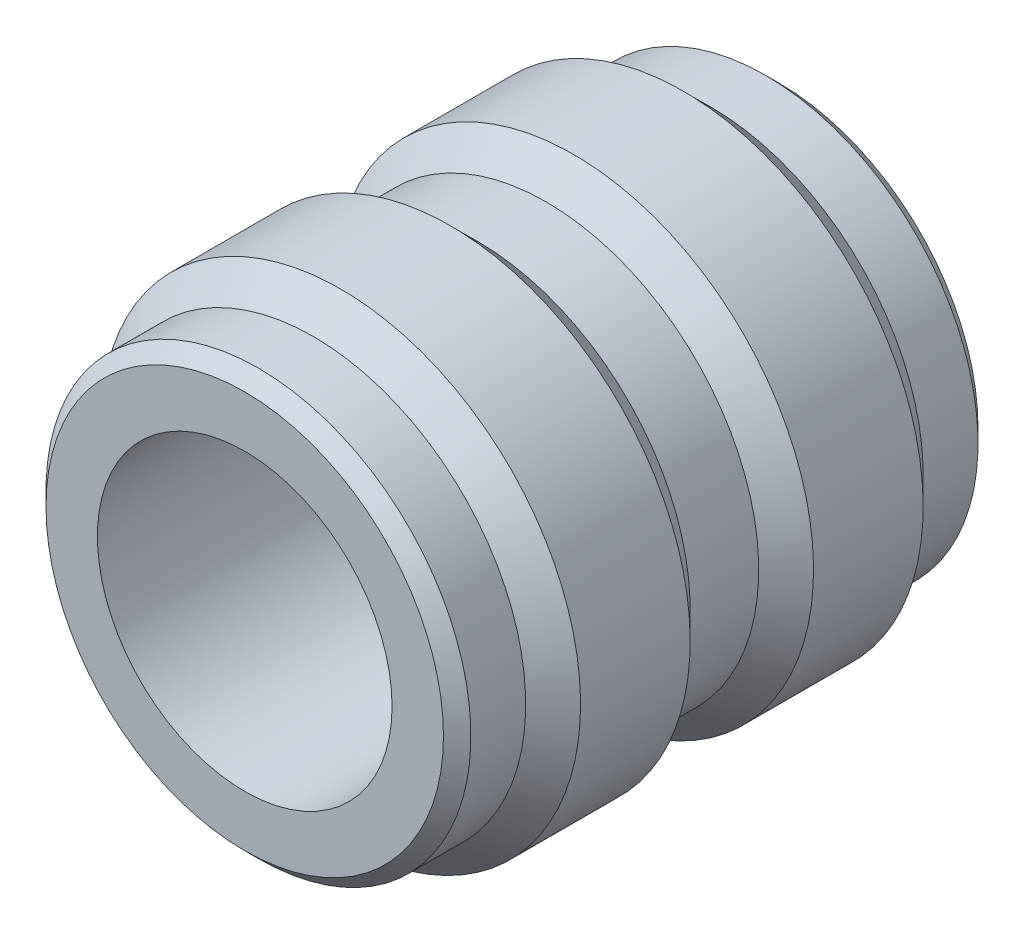
ISO-10303-21;
HEADER;
FILE_DESCRIPTION(('STEP AP214'),'2;1');
FILE_NAME('part.step','',(''),(''),'','','');
FILE_SCHEMA(('AUTOMOTIVE_DESIGN { 1 0 10303 214 1 1 1 1 }'));
ENDSEC;
DATA;
#1=APPLICATION_CONTEXT('core data for automotive mechanical design processes');
#2=APPLICATION_PROTOCOL_DEFINITION('international standard','automotive_design',2000,#1);
#3=PRODUCT_CONTEXT('',#1,'mechanical');
#4=PRODUCT('Part','Part','',(#3));
#5=PRODUCT_RELATED_PRODUCT_CATEGORY('part','',(#4));
#6=PRODUCT_DEFINITION_FORMATION('','',#4);
#7=PRODUCT_DEFINITION_CONTEXT('part definition',#1,'design');
#8=PRODUCT_DEFINITION('design','',#6,#7);
#9=PRODUCT_DEFINITION_SHAPE('','',#8);
#10=(LENGTH_UNIT() NAMED_UNIT(*) SI_UNIT(.MILLI.,.METRE.));
#11=(NAMED_UNIT(*) PLANE_ANGLE_UNIT() SI_UNIT($,.RADIAN.));
#12=(NAMED_UNIT(*) SI_UNIT($,.STERADIAN.) SOLID_ANGLE_UNIT());
#13=UNCERTAINTY_MEASURE_WITH_UNIT(LENGTH_MEASURE(1.E-05),#10,'distance_accuracy_value','');
#14=(GEOMETRIC_REPRESENTATION_CONTEXT(3) GLOBAL_UNCERTAINTY_ASSIGNED_CONTEXT((#13)) GLOBAL_UNIT_ASSIGNED_CONTEXT((#10,
#11,#12)) REPRESENTATION_CONTEXT('',''));
#15=CARTESIAN_POINT('',(0.,0.,0.));
#16=DIRECTION('',(0.,0.,1.));
#17=DIRECTION('',(1.,0.,0.));
#18=AXIS2_PLACEMENT_3D('',#15,#16,#17);
#19=CARTESIAN_POINT('',(0.,0.,-1.825));
#20=DIRECTION('',(0.,0.,-1.));
#21=DIRECTION('',(0.,1.,0.));
#22=AXIS2_PLACEMENT_3D('',#19,#20,#21);
#23=CYLINDRICAL_SURFACE('',#22,1.55);
#24=CARTESIAN_POINT('',(0.,0.,-2.2));
#25=DIRECTION('',(0.,0.,-1.));
#26=DIRECTION('',(1.,0.,0.));
#27=AXIS2_PLACEMENT_3D('',#24,#25,#26);
#28=CIRCLE('',#27,1.55);
#29=CARTESIAN_POINT('',(0.,-1.55,-2.2));
#30=VERTEX_POINT('',#29);
#31=EDGE_CURVE('E183',#30,#30,#28,.T.);
#32=ORIENTED_EDGE('',*,*,#31,.F.);
#33=DIRECTION('',(0.,0.,1.));
#34=VECTOR('',#33,1.);
#35=CARTESIAN_POINT('',(0.,-1.55,-1.825));
#36=LINE('',#35,#34);
#37=CARTESIAN_POINT('',(0.,-1.55,-1.7));
#38=VERTEX_POINT('',#37);
#39=EDGE_CURVE('E11',#30,#38,#36,.T.);
#40=ORIENTED_EDGE('',*,*,#39,.T.);
#41=CARTESIAN_POINT('',(0.,0.,-1.7));
#42=DIRECTION('',(0.,0.,-1.));
#43=DIRECTION('',(1.,0.,0.));
#44=AXIS2_PLACEMENT_3D('',#41,#42,#43);
#45=CIRCLE('',#44,1.55);
#46=EDGE_CURVE('E212',#38,#38,#45,.T.);
#47=ORIENTED_EDGE('',*,*,#46,.T.);
#48=ORIENTED_EDGE('',*,*,#39,.F.);
#49=EDGE_LOOP('',(#32,#40,#47,#48));
#50=FACE_BOUND('',#49,.T.);
#51=ADVANCED_FACE('F54',(#50),#23,.T.);
#52=CARTESIAN_POINT('',(0.,0.,-1.6));
#53=DIRECTION('',(0.,0.,1.));
#54=DIRECTION('',(0.,1.,0.));
#55=AXIS2_PLACEMENT_3D('',#52,#53,#54);
#56=CONICAL_SURFACE('',#55,1.65,0.785398163397448);
#57=ORIENTED_EDGE('',*,*,#46,.F.);
#58=DIRECTION('',(0.,-0.707106781186548,0.707106781186547));
#59=VECTOR('',#58,1.);
#60=CARTESIAN_POINT('',(0.,-1.65,-1.6));
#61=LINE('',#60,#59);
#62=CARTESIAN_POINT('',(0.,-1.75,-1.5));
#63=VERTEX_POINT('',#62);
#64=EDGE_CURVE('E62',#38,#63,#61,.T.);
#65=ORIENTED_EDGE('',*,*,#64,.T.);
#66=CARTESIAN_POINT('',(0.,0.,-1.5));
#67=DIRECTION('',(0.,0.,-1.));
#68=DIRECTION('',(1.,0.,0.));
#69=AXIS2_PLACEMENT_3D('',#66,#67,#68);
#70=CIRCLE('',#69,1.75);
#71=EDGE_CURVE('E210',#63,#63,#70,.T.);
#72=ORIENTED_EDGE('',*,*,#71,.T.);
#73=ORIENTED_EDGE('',*,*,#64,.F.);
#74=EDGE_LOOP('',(#57,#65,#72,#73));
#75=FACE_BOUND('',#74,.T.);
#76=ADVANCED_FACE('F219',(#75),#56,.T.);
#77=CARTESIAN_POINT('',(0.,0.,-1.1));
#78=DIRECTION('',(0.,0.,-1.));
#79=DIRECTION('',(0.,1.,0.));
#80=AXIS2_PLACEMENT_3D('',#77,#78,#79);
#81=CYLINDRICAL_SURFACE('',#80,1.75);
#82=ORIENTED_EDGE('',*,*,#71,.F.);
#83=DIRECTION('',(0.,0.,1.));
#84=VECTOR('',#83,1.);
#85=CARTESIAN_POINT('',(0.,-1.75,-1.1));
#86=LINE('',#85,#84);
#87=CARTESIAN_POINT('',(0.,-1.75,-0.7));
#88=VERTEX_POINT('',#87);
#89=EDGE_CURVE('E213',#63,#88,#86,.T.);
#90=ORIENTED_EDGE('',*,*,#89,.T.);
#91=CARTESIAN_POINT('',(0.,0.,-0.7));
#92=DIRECTION('',(0.,0.,-1.));
#93=DIRECTION('',(1.,0.,0.));
#94=AXIS2_PLACEMENT_3D('',#91,#92,#93);
#95=CIRCLE('',#94,1.75);
#96=EDGE_CURVE('E202',#88,#88,#95,.T.);
#97=ORIENTED_EDGE('',*,*,#96,.T.);
#98=ORIENTED_EDGE('',*,*,#89,.F.);
#99=EDGE_LOOP('',(#82,#90,#97,#98));
#100=FACE_BOUND('',#99,.T.);
#101=ADVANCED_FACE('F223',(#100),#81,.T.);
#102=CARTESIAN_POINT('',(0.,0.,-0.6));
#103=DIRECTION('',(0.,0.,-1.));
#104=DIRECTION('',(0.,1.,0.));
#105=AXIS2_PLACEMENT_3D('',#102,#103,#104);
#106=CONICAL_SURFACE('',#105,1.65,0.785398163397447);
#107=ORIENTED_EDGE('',*,*,#96,.F.);
#108=DIRECTION('',(0.,0.707106781186547,0.707106781186548));
#109=VECTOR('',#108,1.);
#110=CARTESIAN_POINT('',(0.,-1.65,-0.6));
#111=LINE('',#110,#109);
#112=CARTESIAN_POINT('',(0.,-1.55,-0.5));
#113=VERTEX_POINT('',#112);
#114=EDGE_CURVE('E129',#88,#113,#111,.T.);
#115=ORIENTED_EDGE('',*,*,#114,.T.);
#116=CARTESIAN_POINT('',(0.,0.,-0.5));
#117=DIRECTION('',(0.,0.,-1.));
#118=DIRECTION('',(1.,0.,0.));
#119=AXIS2_PLACEMENT_3D('',#116,#117,#118);
#120=CIRCLE('',#119,1.55);
#121=EDGE_CURVE('E174',#113,#113,#120,.T.);
#122=ORIENTED_EDGE('',*,*,#121,.T.);
#123=ORIENTED_EDGE('',*,*,#114,.F.);
#124=EDGE_LOOP('',(#107,#115,#122,#123));
#125=FACE_BOUND('',#124,.T.);
#126=ADVANCED_FACE('F352',(#125),#106,.T.);
#127=CARTESIAN_POINT('',(0.,0.,-2.3));
#128=DIRECTION('',(0.,0.,-1.));
#129=DIRECTION('',(0.,1.,0.));
#130=AXIS2_PLACEMENT_3D('',#127,#128,#129);
#131=CONICAL_SURFACE('',#130,1.65,0.785398163397448);
#132=ORIENTED_EDGE('',*,*,#31,.T.);
#133=DIRECTION('',(0.,-0.707106781186548,-0.707106781186547));
#134=VECTOR('',#133,1.);
#135=CARTESIAN_POINT('',(0.,-1.65,-2.3));
#136=LINE('',#135,#134);
#137=CARTESIAN_POINT('',(0.,-1.75,-2.4));
#138=VERTEX_POINT('',#137);
#139=EDGE_CURVE('E190',#30,#138,#136,.T.);
#140=ORIENTED_EDGE('',*,*,#139,.T.);
#141=CARTESIAN_POINT('',(0.,0.,-2.4));
#142=DIRECTION('',(0.,0.,-1.));
#143=DIRECTION('',(1.,0.,0.));
#144=AXIS2_PLACEMENT_3D('',#141,#142,#143);
#145=CIRCLE('',#144,1.75);
#146=EDGE_CURVE('E199',#138,#138,#145,.T.);
#147=ORIENTED_EDGE('',*,*,#146,.F.);
#148=ORIENTED_EDGE('',*,*,#139,.F.);
#149=EDGE_LOOP('',(#132,#140,#147,#148));
#150=FACE_BOUND('',#149,.T.);
#151=ADVANCED_FACE('F250',(#150),#131,.T.);
#152=CARTESIAN_POINT('',(0.,0.,-2.8));
#153=DIRECTION('',(0.,0.,-1.));
#154=DIRECTION('',(0.,1.,0.));
#155=AXIS2_PLACEMENT_3D('',#152,#153,#154);
#156=CYLINDRICAL_SURFACE('',#155,1.75);
#157=ORIENTED_EDGE('',*,*,#146,.T.);
#158=DIRECTION('',(0.,0.,-1.));
#159=VECTOR('',#158,1.);
#160=CARTESIAN_POINT('',(0.,-1.75,-2.8));
#161=LINE('',#160,#159);
#162=CARTESIAN_POINT('',(0.,-1.75,-3.2));
#163=VERTEX_POINT('',#162);
#164=EDGE_CURVE('E187',#138,#163,#161,.T.);
#165=ORIENTED_EDGE('',*,*,#164,.T.);
#166=CARTESIAN_POINT('',(0.,0.,-3.2));
#167=DIRECTION('',(0.,0.,-1.));
#168=DIRECTION('',(1.,0.,0.));
#169=AXIS2_PLACEMENT_3D('',#166,#167,#168);
#170=CIRCLE('',#169,1.75);
#171=EDGE_CURVE('E194',#163,#163,#170,.T.);
#172=ORIENTED_EDGE('',*,*,#171,.F.);
#173=ORIENTED_EDGE('',*,*,#164,.F.);
#174=EDGE_LOOP('',(#157,#165,#172,#173));
#175=FACE_BOUND('',#174,.T.);
#176=ADVANCED_FACE('F243',(#175),#156,.T.);
#177=CARTESIAN_POINT('',(0.,0.,-3.3));
#178=DIRECTION('',(0.,0.,1.));
#179=DIRECTION('',(0.,1.,0.));
#180=AXIS2_PLACEMENT_3D('',#177,#178,#179);
#181=CONICAL_SURFACE('',#180,1.65,0.785398163397447);
#182=ORIENTED_EDGE('',*,*,#171,.T.);
#183=DIRECTION('',(0.,0.707106781186547,-0.707106781186548));
#184=VECTOR('',#183,1.);
#185=CARTESIAN_POINT('',(0.,-1.65,-3.3));
#186=LINE('',#185,#184);
#187=CARTESIAN_POINT('',(0.,-1.55,-3.4));
#188=VERTEX_POINT('',#187);
#189=EDGE_CURVE('E200',#163,#188,#186,.T.);
#190=ORIENTED_EDGE('',*,*,#189,.T.);
#191=CARTESIAN_POINT('',(0.,0.,-3.4));
#192=DIRECTION('',(0.,0.,-1.));
#193=DIRECTION('',(1.,0.,0.));
#194=AXIS2_PLACEMENT_3D('',#191,#192,#193);
#195=CIRCLE('',#194,1.55);
#196=EDGE_CURVE('E185',#188,#188,#195,.T.);
#197=ORIENTED_EDGE('',*,*,#196,.F.);
#198=ORIENTED_EDGE('',*,*,#189,.F.);
#199=EDGE_LOOP('',(#182,#190,#197,#198));
#200=FACE_BOUND('',#199,.T.);
#201=ADVANCED_FACE('F298',(#200),#181,.T.);
#202=CARTESIAN_POINT('',(0.,0.,-3.65));
#203=DIRECTION('',(0.,0.,-1.));
#204=DIRECTION('',(0.,1.,0.));
#205=AXIS2_PLACEMENT_3D('',#202,#203,#204);
#206=CYLINDRICAL_SURFACE('',#205,1.55);
#207=ORIENTED_EDGE('',*,*,#196,.T.);
#208=DIRECTION('',(0.,0.,-1.));
#209=VECTOR('',#208,1.);
#210=CARTESIAN_POINT('',(0.,-1.55,-3.65));
#211=LINE('',#210,#209);
#212=CARTESIAN_POINT('',(0.,-1.55,-3.8));
#213=VERTEX_POINT('',#212);
#214=EDGE_CURVE('E95',#188,#213,#211,.T.);
#215=ORIENTED_EDGE('',*,*,#214,.T.);
#216=CARTESIAN_POINT('',(0.,0.,-3.8));
#217=DIRECTION('',(0.,0.,-1.));
#218=DIRECTION('',(0.,-1.,0.));
#219=AXIS2_PLACEMENT_3D('',#216,#217,#218);
#220=CIRCLE('',#219,1.55);
#221=CARTESIAN_POINT('',(0.,1.55,-3.8));
#222=VERTEX_POINT('',#221);
#223=EDGE_CURVE('E169',#222,#213,#220,.T.);
#224=ORIENTED_EDGE('',*,*,#223,.F.);
#225=CARTESIAN_POINT('',(0.,0.,-3.8));
#226=DIRECTION('',(0.,0.,-1.));
#227=DIRECTION('',(0.,-1.,0.));
#228=AXIS2_PLACEMENT_3D('',#225,#226,#227);
#229=CIRCLE('',#228,1.55);
#230=EDGE_CURVE('E110',#213,#222,#229,.T.);
#231=ORIENTED_EDGE('',*,*,#230,.F.);
#232=ORIENTED_EDGE('',*,*,#214,.F.);
#233=EDGE_LOOP('',(#207,#215,#224,#231,#232));
#234=FACE_BOUND('',#233,.T.);
#235=ADVANCED_FACE('F332',(#234),#206,.T.);
#236=CARTESIAN_POINT('',(0.,1.55,-3.9));
#237=DIRECTION('',(0.,0.,1.));
#238=DIRECTION('',(1.,0.,0.));
#239=AXIS2_PLACEMENT_3D('',#236,#237,#238);
#240=PLANE('',#239);
#241=CARTESIAN_POINT('',(0.,0.,-3.9));
#242=DIRECTION('',(0.,0.,-1.));
#243=DIRECTION('',(-1.,0.,0.));
#244=AXIS2_PLACEMENT_3D('',#241,#242,#243);
#245=CIRCLE('',#244,1.075);
#246=CARTESIAN_POINT('',(-1.075,0.,-3.9));
#247=VERTEX_POINT('',#246);
#248=EDGE_CURVE('E163',#247,#247,#245,.F.);
#249=ORIENTED_EDGE('',*,*,#248,.T.);
#250=EDGE_LOOP('',(#249));
#251=FACE_BOUND('',#250,.T.);
#252=CARTESIAN_POINT('',(0.,0.,-3.9));
#253=DIRECTION('',(0.,0.,1.));
#254=DIRECTION('',(0.,-1.,0.));
#255=AXIS2_PLACEMENT_3D('',#252,#253,#254);
#256=CIRCLE('',#255,1.45);
#257=CARTESIAN_POINT('',(0.,1.45,-3.9));
#258=VERTEX_POINT('',#257);
#259=EDGE_CURVE('E172',#258,#258,#256,.T.);
#260=ORIENTED_EDGE('',*,*,#259,.F.);
#261=EDGE_LOOP('',(#260));
#262=FACE_BOUND('',#261,.T.);
#263=ADVANCED_FACE('F327',(#251,#262),#240,.F.);
#264=CARTESIAN_POINT('',(0.,0.,-3.85));
#265=DIRECTION('',(0.,0.,1.));
#266=DIRECTION('',(0.,-1.,0.));
#267=AXIS2_PLACEMENT_3D('',#264,#265,#266);
#268=CONICAL_SURFACE('',#267,1.5,0.785398163397448);
#269=ORIENTED_EDGE('',*,*,#259,.T.);
#270=DIRECTION('',(0.,0.707106781186548,0.707106781186548));
#271=VECTOR('',#270,1.);
#272=CARTESIAN_POINT('',(0.,1.5,-3.85));
#273=LINE('',#272,#271);
#274=EDGE_CURVE('E177',#258,#222,#273,.T.);
#275=ORIENTED_EDGE('',*,*,#274,.T.);
#276=ORIENTED_EDGE('',*,*,#223,.T.);
#277=ORIENTED_EDGE('',*,*,#230,.T.);
#278=ORIENTED_EDGE('',*,*,#274,.F.);
#279=EDGE_LOOP('',(#269,#275,#276,#277,#278));
#280=FACE_BOUND('',#279,.T.);
#281=ADVANCED_FACE('F317',(#280),#268,.T.);
#282=CARTESIAN_POINT('',(0.,0.,-0.25));
#283=DIRECTION('',(0.,0.,-1.));
#284=DIRECTION('',(0.,1.,0.));
#285=AXIS2_PLACEMENT_3D('',#282,#283,#284);
#286=CYLINDRICAL_SURFACE('',#285,1.55);
#287=ORIENTED_EDGE('',*,*,#121,.F.);
#288=DIRECTION('',(0.,0.,1.));
#289=VECTOR('',#288,1.);
#290=CARTESIAN_POINT('',(0.,-1.55,-0.25));
#291=LINE('',#290,#289);
#292=CARTESIAN_POINT('',(0.,-1.55,-0.1));
#293=VERTEX_POINT('',#292);
#294=EDGE_CURVE('E159',#113,#293,#291,.T.);
#295=ORIENTED_EDGE('',*,*,#294,.T.);
#296=CARTESIAN_POINT('',(0.,0.,-0.1));
#297=DIRECTION('',(0.,0.,1.));
#298=DIRECTION('',(0.,-1.,0.));
#299=AXIS2_PLACEMENT_3D('',#296,#297,#298);
#300=CIRCLE('',#299,1.55);
#301=CARTESIAN_POINT('',(0.,1.55,-0.1));
#302=VERTEX_POINT('',#301);
#303=EDGE_CURVE('E146',#302,#293,#300,.T.);
#304=ORIENTED_EDGE('',*,*,#303,.F.);
#305=CARTESIAN_POINT('',(0.,0.,-0.1));
#306=DIRECTION('',(0.,0.,1.));
#307=DIRECTION('',(0.,-1.,0.));
#308=AXIS2_PLACEMENT_3D('',#305,#306,#307);
#309=CIRCLE('',#308,1.55);
#310=EDGE_CURVE('E153',#293,#302,#309,.T.);
#311=ORIENTED_EDGE('',*,*,#310,.F.);
#312=ORIENTED_EDGE('',*,*,#294,.F.);
#313=EDGE_LOOP('',(#287,#295,#304,#311,#312));
#314=FACE_BOUND('',#313,.T.);
#315=ADVANCED_FACE('F156',(#314),#286,.T.);
#316=CARTESIAN_POINT('',(0.,1.55,0.));
#317=DIRECTION('',(0.,0.,1.));
#318=DIRECTION('',(1.,0.,0.));
#319=AXIS2_PLACEMENT_3D('',#316,#317,#318);
#320=PLANE('',#319);
#321=CARTESIAN_POINT('',(0.,0.,0.));
#322=DIRECTION('',(0.,0.,1.));
#323=DIRECTION('',(1.,0.,0.));
#324=AXIS2_PLACEMENT_3D('',#321,#322,#323);
#325=CIRCLE('',#324,1.075);
#326=CARTESIAN_POINT('',(1.075,0.,0.));
#327=VERTEX_POINT('',#326);
#328=EDGE_CURVE('E168',#327,#327,#325,.T.);
#329=ORIENTED_EDGE('',*,*,#328,.F.);
#330=EDGE_LOOP('',(#329));
#331=FACE_BOUND('',#330,.T.);
#332=CARTESIAN_POINT('',(0.,0.,0.));
#333=DIRECTION('',(0.,0.,-1.));
#334=DIRECTION('',(0.,-1.,0.));
#335=AXIS2_PLACEMENT_3D('',#332,#333,#334);
#336=CIRCLE('',#335,1.45);
#337=CARTESIAN_POINT('',(0.,1.45,0.));
#338=VERTEX_POINT('',#337);
#339=EDGE_CURVE('E139',#338,#338,#336,.T.);
#340=ORIENTED_EDGE('',*,*,#339,.F.);
#341=EDGE_LOOP('',(#340));
#342=FACE_BOUND('',#341,.T.);
#343=ADVANCED_FACE('F299',(#331,#342),#320,.T.);
#344=CARTESIAN_POINT('',(0.,0.,-0.05));
#345=DIRECTION('',(0.,0.,-1.));
#346=DIRECTION('',(0.,-1.,0.));
#347=AXIS2_PLACEMENT_3D('',#344,#345,#346);
#348=CONICAL_SURFACE('',#347,1.5,0.785398163397449);
#349=ORIENTED_EDGE('',*,*,#303,.T.);
#350=ORIENTED_EDGE('',*,*,#310,.T.);
#351=DIRECTION('',(0.,-0.707106781186548,0.707106781186547));
#352=VECTOR('',#351,1.);
#353=CARTESIAN_POINT('',(0.,1.5,-0.05));
#354=LINE('',#353,#352);
#355=EDGE_CURVE('E144',#302,#338,#354,.T.);
#356=ORIENTED_EDGE('',*,*,#355,.T.);
#357=ORIENTED_EDGE('',*,*,#339,.T.);
#358=ORIENTED_EDGE('',*,*,#355,.F.);
#359=EDGE_LOOP('',(#349,#350,#356,#357,#358));
#360=FACE_BOUND('',#359,.T.);
#361=ADVANCED_FACE('F150',(#360),#348,.T.);
#362=CARTESIAN_POINT('',(0.,0.,-10.));
#363=DIRECTION('',(0.,0.,1.));
#364=DIRECTION('',(1.,0.,0.));
#365=AXIS2_PLACEMENT_3D('',#362,#363,#364);
#366=CYLINDRICAL_SURFACE('',#365,1.075);
#367=ORIENTED_EDGE('',*,*,#328,.T.);
#368=EDGE_LOOP('',(#367));
#369=FACE_BOUND('',#368,.T.);
#370=ORIENTED_EDGE('',*,*,#248,.F.);
#371=EDGE_LOOP('',(#370));
#372=FACE_BOUND('',#371,.T.);
#373=ADVANCED_FACE('F315',(#369,#372),#366,.F.);
#374=CLOSED_SHELL('',(#51,#76,#101,#126,#151,#176,#201,#235,#263,#281,#315,#343,#361,#373));
#375=MANIFOLD_SOLID_BREP('B2',#374);
#376=ADVANCED_BREP_SHAPE_REPRESENTATION('',(#18,#375),#14);
#377=SHAPE_DEFINITION_REPRESENTATION(#9,#376);
ENDSEC;
END-ISO-10303-21;
